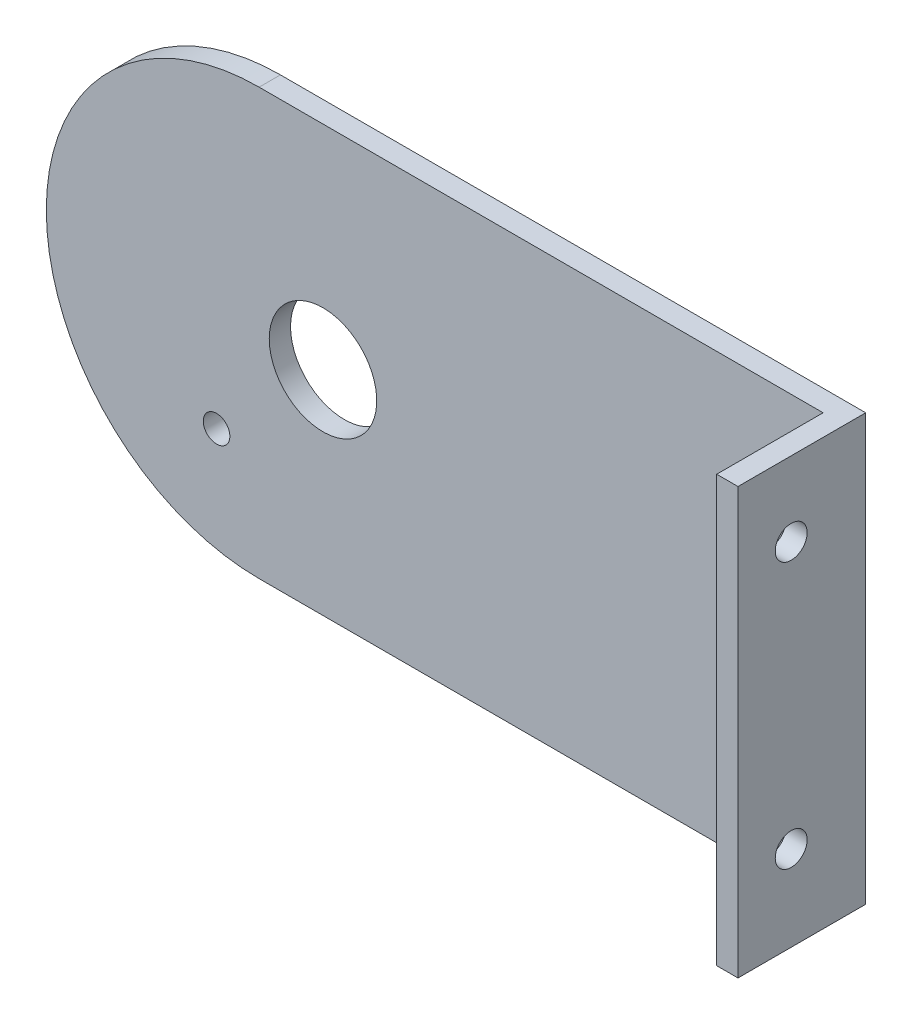
ISO-10303-21;
HEADER;
FILE_DESCRIPTION(('STEP AP214'),'2;1');
FILE_NAME('part.step','',(''),(''),'','','');
FILE_SCHEMA(('AUTOMOTIVE_DESIGN { 1 0 10303 214 1 1 1 1 }'));
ENDSEC;
DATA;
#1=APPLICATION_CONTEXT('core data for automotive mechanical design processes');
#2=APPLICATION_PROTOCOL_DEFINITION('international standard','automotive_design',2000,#1);
#3=PRODUCT_CONTEXT('',#1,'mechanical');
#4=PRODUCT('Part','Part','',(#3));
#5=PRODUCT_RELATED_PRODUCT_CATEGORY('part','',(#4));
#6=PRODUCT_DEFINITION_FORMATION('','',#4);
#7=PRODUCT_DEFINITION_CONTEXT('part definition',#1,'design');
#8=PRODUCT_DEFINITION('design','',#6,#7);
#9=PRODUCT_DEFINITION_SHAPE('','',#8);
#10=(LENGTH_UNIT() NAMED_UNIT(*) SI_UNIT(.MILLI.,.METRE.));
#11=(NAMED_UNIT(*) PLANE_ANGLE_UNIT() SI_UNIT($,.RADIAN.));
#12=(NAMED_UNIT(*) SI_UNIT($,.STERADIAN.) SOLID_ANGLE_UNIT());
#13=UNCERTAINTY_MEASURE_WITH_UNIT(LENGTH_MEASURE(1.E-05),#10,'distance_accuracy_value','');
#14=(GEOMETRIC_REPRESENTATION_CONTEXT(3) GLOBAL_UNCERTAINTY_ASSIGNED_CONTEXT((#13)) GLOBAL_UNIT_ASSIGNED_CONTEXT((#10,
#11,#12)) REPRESENTATION_CONTEXT('',''));
#15=CARTESIAN_POINT('',(0.,0.,0.));
#16=DIRECTION('',(0.,0.,1.));
#17=DIRECTION('',(1.,0.,0.));
#18=AXIS2_PLACEMENT_3D('',#15,#16,#17);
#19=CARTESIAN_POINT('',(75.,0.,2.));
#20=DIRECTION('',(0.,1.,0.));
#21=DIRECTION('',(-1.,0.,0.));
#22=AXIS2_PLACEMENT_3D('',#19,#20,#21);
#23=PLANE('',#22);
#24=DIRECTION('',(1.,0.,0.));
#25=VECTOR('',#24,1.);
#26=CARTESIAN_POINT('',(75.,0.,0.));
#27=LINE('',#26,#25);
#28=CARTESIAN_POINT('',(20.,0.,0.));
#29=VERTEX_POINT('',#28);
#30=CARTESIAN_POINT('',(75.,0.,0.));
#31=VERTEX_POINT('',#30);
#32=EDGE_CURVE('E107',#29,#31,#27,.T.);
#33=ORIENTED_EDGE('',*,*,#32,.T.);
#34=DIRECTION('',(0.,0.,-1.));
#35=VECTOR('',#34,1.);
#36=CARTESIAN_POINT('',(75.,0.,2.));
#37=LINE('',#36,#35);
#38=CARTESIAN_POINT('',(75.,0.,12.));
#39=VERTEX_POINT('',#38);
#40=EDGE_CURVE('E101',#39,#31,#37,.T.);
#41=ORIENTED_EDGE('',*,*,#40,.F.);
#42=DIRECTION('',(-1.,0.,0.));
#43=VECTOR('',#42,1.);
#44=CARTESIAN_POINT('',(75.,0.,12.));
#45=LINE('',#44,#43);
#46=CARTESIAN_POINT('',(73.,0.,12.));
#47=VERTEX_POINT('',#46);
#48=EDGE_CURVE('E104',#39,#47,#45,.T.);
#49=ORIENTED_EDGE('',*,*,#48,.T.);
#50=DIRECTION('',(0.,0.,-1.));
#51=VECTOR('',#50,1.);
#52=CARTESIAN_POINT('',(73.,0.,12.));
#53=LINE('',#52,#51);
#54=CARTESIAN_POINT('',(73.,0.,2.));
#55=VERTEX_POINT('',#54);
#56=EDGE_CURVE('E136',#47,#55,#53,.T.);
#57=ORIENTED_EDGE('',*,*,#56,.T.);
#58=DIRECTION('',(1.,0.,0.));
#59=VECTOR('',#58,1.);
#60=CARTESIAN_POINT('',(75.,0.,2.));
#61=LINE('',#60,#59);
#62=CARTESIAN_POINT('',(20.,0.,2.));
#63=VERTEX_POINT('',#62);
#64=EDGE_CURVE('E64',#63,#55,#61,.T.);
#65=ORIENTED_EDGE('',*,*,#64,.F.);
#66=DIRECTION('',(0.,0.,-1.));
#67=VECTOR('',#66,1.);
#68=CARTESIAN_POINT('',(20.,0.,2.));
#69=LINE('',#68,#67);
#70=EDGE_CURVE('E111',#63,#29,#69,.T.);
#71=ORIENTED_EDGE('',*,*,#70,.T.);
#72=EDGE_LOOP('',(#33,#41,#49,#57,#65,#71));
#73=FACE_BOUND('',#72,.T.);
#74=ADVANCED_FACE('F43',(#73),#23,.F.);
#75=CARTESIAN_POINT('',(75.,40.,2.));
#76=DIRECTION('',(-1.,0.,0.));
#77=DIRECTION('',(0.,0.,1.));
#78=AXIS2_PLACEMENT_3D('',#75,#76,#77);
#79=PLANE('',#78);
#80=CARTESIAN_POINT('',(75.,33.,7.));
#81=DIRECTION('',(-1.,0.,0.));
#82=DIRECTION('',(0.,0.,1.));
#83=AXIS2_PLACEMENT_3D('',#80,#81,#82);
#84=CIRCLE('',#83,1.5);
#85=CARTESIAN_POINT('',(75.,33.,8.5));
#86=VERTEX_POINT('',#85);
#87=EDGE_CURVE('E126',#86,#86,#84,.T.);
#88=ORIENTED_EDGE('',*,*,#87,.T.);
#89=EDGE_LOOP('',(#88));
#90=FACE_BOUND('',#89,.T.);
#91=CARTESIAN_POINT('',(75.,8.,7.));
#92=DIRECTION('',(-1.,0.,0.));
#93=DIRECTION('',(0.,0.,1.));
#94=AXIS2_PLACEMENT_3D('',#91,#92,#93);
#95=CIRCLE('',#94,1.5);
#96=CARTESIAN_POINT('',(75.,8.,8.5));
#97=VERTEX_POINT('',#96);
#98=EDGE_CURVE('E129',#97,#97,#95,.T.);
#99=ORIENTED_EDGE('',*,*,#98,.T.);
#100=EDGE_LOOP('',(#99));
#101=FACE_BOUND('',#100,.T.);
#102=DIRECTION('',(0.,1.,0.));
#103=VECTOR('',#102,1.);
#104=CARTESIAN_POINT('',(75.,40.,0.));
#105=LINE('',#104,#103);
#106=CARTESIAN_POINT('',(75.,40.,0.));
#107=VERTEX_POINT('',#106);
#108=EDGE_CURVE('E159',#31,#107,#105,.T.);
#109=ORIENTED_EDGE('',*,*,#108,.T.);
#110=DIRECTION('',(0.,0.,-1.));
#111=VECTOR('',#110,1.);
#112=CARTESIAN_POINT('',(75.,40.,2.));
#113=LINE('',#112,#111);
#114=CARTESIAN_POINT('',(75.,40.,12.));
#115=VERTEX_POINT('',#114);
#116=EDGE_CURVE('E112',#115,#107,#113,.T.);
#117=ORIENTED_EDGE('',*,*,#116,.F.);
#118=DIRECTION('',(0.,-1.,0.));
#119=VECTOR('',#118,1.);
#120=CARTESIAN_POINT('',(75.,0.,12.));
#121=LINE('',#120,#119);
#122=EDGE_CURVE('E119',#115,#39,#121,.T.);
#123=ORIENTED_EDGE('',*,*,#122,.T.);
#124=ORIENTED_EDGE('',*,*,#40,.T.);
#125=EDGE_LOOP('',(#109,#117,#123,#124));
#126=FACE_BOUND('',#125,.T.);
#127=ADVANCED_FACE('F124',(#90,#101,#126),#79,.F.);
#128=CARTESIAN_POINT('',(0.,40.,2.));
#129=DIRECTION('',(0.,-1.,0.));
#130=DIRECTION('',(0.,0.,-1.));
#131=AXIS2_PLACEMENT_3D('',#128,#129,#130);
#132=PLANE('',#131);
#133=DIRECTION('',(-1.,0.,0.));
#134=VECTOR('',#133,1.);
#135=CARTESIAN_POINT('',(0.,40.,2.));
#136=LINE('',#135,#134);
#137=CARTESIAN_POINT('',(73.,40.,2.));
#138=VERTEX_POINT('',#137);
#139=CARTESIAN_POINT('',(20.,40.,2.));
#140=VERTEX_POINT('',#139);
#141=EDGE_CURVE('E155',#138,#140,#136,.T.);
#142=ORIENTED_EDGE('',*,*,#141,.F.);
#143=DIRECTION('',(0.,0.,-1.));
#144=VECTOR('',#143,1.);
#145=CARTESIAN_POINT('',(73.,40.,12.));
#146=LINE('',#145,#144);
#147=CARTESIAN_POINT('',(73.,40.,12.));
#148=VERTEX_POINT('',#147);
#149=EDGE_CURVE('E137',#148,#138,#146,.T.);
#150=ORIENTED_EDGE('',*,*,#149,.F.);
#151=DIRECTION('',(1.,0.,0.));
#152=VECTOR('',#151,1.);
#153=CARTESIAN_POINT('',(75.,40.,12.));
#154=LINE('',#153,#152);
#155=EDGE_CURVE('E134',#148,#115,#154,.T.);
#156=ORIENTED_EDGE('',*,*,#155,.T.);
#157=ORIENTED_EDGE('',*,*,#116,.T.);
#158=DIRECTION('',(-1.,0.,0.));
#159=VECTOR('',#158,1.);
#160=CARTESIAN_POINT('',(0.,40.,0.));
#161=LINE('',#160,#159);
#162=CARTESIAN_POINT('',(20.,40.,0.));
#163=VERTEX_POINT('',#162);
#164=EDGE_CURVE('E156',#107,#163,#161,.T.);
#165=ORIENTED_EDGE('',*,*,#164,.T.);
#166=DIRECTION('',(0.,0.,-1.));
#167=VECTOR('',#166,1.);
#168=CARTESIAN_POINT('',(20.,40.,2.));
#169=LINE('',#168,#167);
#170=EDGE_CURVE('E11',#163,#140,#169,.F.);
#171=ORIENTED_EDGE('',*,*,#170,.T.);
#172=EDGE_LOOP('',(#142,#150,#156,#157,#165,#171));
#173=FACE_BOUND('',#172,.T.);
#174=ADVANCED_FACE('F187',(#173),#132,.F.);
#175=CARTESIAN_POINT('',(0.,0.,2.));
#176=DIRECTION('',(0.,0.,-1.));
#177=DIRECTION('',(-1.,0.,0.));
#178=AXIS2_PLACEMENT_3D('',#175,#176,#177);
#179=PLANE('',#178);
#180=CARTESIAN_POINT('',(26.,20.,2.));
#181=DIRECTION('',(0.,0.,-1.));
#182=DIRECTION('',(-1.,0.,0.));
#183=AXIS2_PLACEMENT_3D('',#180,#181,#182);
#184=CIRCLE('',#183,5.05000000000008);
#185=CARTESIAN_POINT('',(20.9499999999999,20.,2.));
#186=VERTEX_POINT('',#185);
#187=EDGE_CURVE('E142',#186,#186,#184,.T.);
#188=ORIENTED_EDGE('',*,*,#187,.T.);
#189=EDGE_LOOP('',(#188));
#190=FACE_BOUND('',#189,.T.);
#191=CARTESIAN_POINT('',(16.,10.2020410288673,2.));
#192=DIRECTION('',(0.,0.,-1.));
#193=DIRECTION('',(-1.,0.,0.));
#194=AXIS2_PLACEMENT_3D('',#191,#192,#193);
#195=CIRCLE('',#194,1.25000000000004);
#196=CARTESIAN_POINT('',(14.75,10.2020410288673,2.));
#197=VERTEX_POINT('',#196);
#198=EDGE_CURVE('E151',#197,#197,#195,.T.);
#199=ORIENTED_EDGE('',*,*,#198,.T.);
#200=EDGE_LOOP('',(#199));
#201=FACE_BOUND('',#200,.T.);
#202=ORIENTED_EDGE('',*,*,#64,.T.);
#203=DIRECTION('',(0.,1.,0.));
#204=VECTOR('',#203,1.);
#205=CARTESIAN_POINT('',(73.,0.,2.));
#206=LINE('',#205,#204);
#207=EDGE_CURVE('E59',#55,#138,#206,.T.);
#208=ORIENTED_EDGE('',*,*,#207,.T.);
#209=ORIENTED_EDGE('',*,*,#141,.T.);
#210=CARTESIAN_POINT('',(20.,20.,2.));
#211=DIRECTION('',(0.,0.,-1.));
#212=DIRECTION('',(-1.,0.,0.));
#213=AXIS2_PLACEMENT_3D('',#210,#211,#212);
#214=CIRCLE('',#213,20.);
#215=CARTESIAN_POINT('',(0.,20.,2.));
#216=VERTEX_POINT('',#215);
#217=EDGE_CURVE('E169',#140,#216,#214,.F.);
#218=ORIENTED_EDGE('',*,*,#217,.T.);
#219=CARTESIAN_POINT('',(20.,20.,2.));
#220=DIRECTION('',(0.,0.,-1.));
#221=DIRECTION('',(-1.,0.,0.));
#222=AXIS2_PLACEMENT_3D('',#219,#220,#221);
#223=CIRCLE('',#222,20.);
#224=EDGE_CURVE('E52',#216,#63,#223,.F.);
#225=ORIENTED_EDGE('',*,*,#224,.T.);
#226=EDGE_LOOP('',(#202,#208,#209,#218,#225));
#227=FACE_BOUND('',#226,.T.);
#228=ADVANCED_FACE('F172',(#190,#201,#227),#179,.F.);
#229=CARTESIAN_POINT('',(0.,0.,0.));
#230=DIRECTION('',(0.,0.,-1.));
#231=DIRECTION('',(-1.,0.,0.));
#232=AXIS2_PLACEMENT_3D('',#229,#230,#231);
#233=PLANE('',#232);
#234=CARTESIAN_POINT('',(20.,20.,0.));
#235=DIRECTION('',(0.,0.,-1.));
#236=DIRECTION('',(-1.,0.,0.));
#237=AXIS2_PLACEMENT_3D('',#234,#235,#236);
#238=CIRCLE('',#237,20.);
#239=CARTESIAN_POINT('',(0.,20.,0.));
#240=VERTEX_POINT('',#239);
#241=EDGE_CURVE('E164',#240,#163,#238,.T.);
#242=ORIENTED_EDGE('',*,*,#241,.T.);
#243=ORIENTED_EDGE('',*,*,#164,.F.);
#244=ORIENTED_EDGE('',*,*,#108,.F.);
#245=ORIENTED_EDGE('',*,*,#32,.F.);
#246=CARTESIAN_POINT('',(20.,20.,0.));
#247=DIRECTION('',(0.,0.,-1.));
#248=DIRECTION('',(-1.,0.,0.));
#249=AXIS2_PLACEMENT_3D('',#246,#247,#248);
#250=CIRCLE('',#249,20.);
#251=EDGE_CURVE('E167',#29,#240,#250,.T.);
#252=ORIENTED_EDGE('',*,*,#251,.T.);
#253=EDGE_LOOP('',(#242,#243,#244,#245,#252));
#254=FACE_BOUND('',#253,.T.);
#255=CARTESIAN_POINT('',(26.,20.,0.));
#256=DIRECTION('',(0.,0.,-1.));
#257=DIRECTION('',(-1.,0.,0.));
#258=AXIS2_PLACEMENT_3D('',#255,#256,#257);
#259=CIRCLE('',#258,5.05000000000008);
#260=CARTESIAN_POINT('',(20.9499999999999,20.,0.));
#261=VERTEX_POINT('',#260);
#262=EDGE_CURVE('E145',#261,#261,#259,.T.);
#263=ORIENTED_EDGE('',*,*,#262,.F.);
#264=EDGE_LOOP('',(#263));
#265=FACE_BOUND('',#264,.T.);
#266=CARTESIAN_POINT('',(16.,10.2020410288673,0.));
#267=DIRECTION('',(0.,0.,-1.));
#268=DIRECTION('',(-1.,0.,0.));
#269=AXIS2_PLACEMENT_3D('',#266,#267,#268);
#270=CIRCLE('',#269,1.25000000000004);
#271=CARTESIAN_POINT('',(14.75,10.2020410288673,0.));
#272=VERTEX_POINT('',#271);
#273=EDGE_CURVE('E148',#272,#272,#270,.T.);
#274=ORIENTED_EDGE('',*,*,#273,.F.);
#275=EDGE_LOOP('',(#274));
#276=FACE_BOUND('',#275,.T.);
#277=ADVANCED_FACE('F181',(#254,#265,#276),#233,.T.);
#278=CARTESIAN_POINT('',(16.,10.2020410288673,2.));
#279=DIRECTION('',(0.,0.,-1.));
#280=DIRECTION('',(-1.,0.,0.));
#281=AXIS2_PLACEMENT_3D('',#278,#279,#280);
#282=CYLINDRICAL_SURFACE('',#281,1.25000000000004);
#283=ORIENTED_EDGE('',*,*,#198,.F.);
#284=EDGE_LOOP('',(#283));
#285=FACE_BOUND('',#284,.T.);
#286=ORIENTED_EDGE('',*,*,#273,.T.);
#287=EDGE_LOOP('',(#286));
#288=FACE_BOUND('',#287,.T.);
#289=ADVANCED_FACE('F215',(#285,#288),#282,.F.);
#290=CARTESIAN_POINT('',(26.,20.,2.));
#291=DIRECTION('',(0.,0.,-1.));
#292=DIRECTION('',(-1.,0.,0.));
#293=AXIS2_PLACEMENT_3D('',#290,#291,#292);
#294=CYLINDRICAL_SURFACE('',#293,5.05000000000008);
#295=ORIENTED_EDGE('',*,*,#187,.F.);
#296=EDGE_LOOP('',(#295));
#297=FACE_BOUND('',#296,.T.);
#298=ORIENTED_EDGE('',*,*,#262,.T.);
#299=EDGE_LOOP('',(#298));
#300=FACE_BOUND('',#299,.T.);
#301=ADVANCED_FACE('F220',(#297,#300),#294,.F.);
#302=CARTESIAN_POINT('',(20.,20.,2.));
#303=DIRECTION('',(0.,0.,-1.));
#304=DIRECTION('',(-1.,0.,0.));
#305=AXIS2_PLACEMENT_3D('',#302,#303,#304);
#306=CYLINDRICAL_SURFACE('',#305,20.);
#307=DIRECTION('',(0.,0.,-1.));
#308=VECTOR('',#307,1.);
#309=CARTESIAN_POINT('',(0.,20.,2.));
#310=LINE('',#309,#308);
#311=EDGE_CURVE('E47',#216,#240,#310,.T.);
#312=ORIENTED_EDGE('',*,*,#311,.F.);
#313=ORIENTED_EDGE('',*,*,#217,.F.);
#314=ORIENTED_EDGE('',*,*,#170,.F.);
#315=ORIENTED_EDGE('',*,*,#241,.F.);
#316=EDGE_LOOP('',(#312,#313,#314,#315));
#317=FACE_BOUND('',#316,.T.);
#318=ADVANCED_FACE('F45',(#317),#306,.T.);
#319=CARTESIAN_POINT('',(20.,20.,2.));
#320=DIRECTION('',(0.,0.,-1.));
#321=DIRECTION('',(-1.,0.,0.));
#322=AXIS2_PLACEMENT_3D('',#319,#320,#321);
#323=CYLINDRICAL_SURFACE('',#322,20.);
#324=ORIENTED_EDGE('',*,*,#224,.F.);
#325=ORIENTED_EDGE('',*,*,#311,.T.);
#326=ORIENTED_EDGE('',*,*,#251,.F.);
#327=ORIENTED_EDGE('',*,*,#70,.F.);
#328=EDGE_LOOP('',(#324,#325,#326,#327));
#329=FACE_BOUND('',#328,.T.);
#330=ADVANCED_FACE('F178',(#329),#323,.T.);
#331=CARTESIAN_POINT('',(73.,0.,12.));
#332=DIRECTION('',(-1.,0.,0.));
#333=DIRECTION('',(0.,0.,1.));
#334=AXIS2_PLACEMENT_3D('',#331,#332,#333);
#335=PLANE('',#334);
#336=CARTESIAN_POINT('',(73.,33.,7.));
#337=DIRECTION('',(-1.,0.,0.));
#338=DIRECTION('',(0.,0.,1.));
#339=AXIS2_PLACEMENT_3D('',#336,#337,#338);
#340=CIRCLE('',#339,1.5);
#341=CARTESIAN_POINT('',(73.,33.,8.5));
#342=VERTEX_POINT('',#341);
#343=EDGE_CURVE('E299',#342,#342,#340,.T.);
#344=ORIENTED_EDGE('',*,*,#343,.F.);
#345=EDGE_LOOP('',(#344));
#346=FACE_BOUND('',#345,.T.);
#347=CARTESIAN_POINT('',(73.,8.,7.));
#348=DIRECTION('',(-1.,0.,0.));
#349=DIRECTION('',(0.,0.,1.));
#350=AXIS2_PLACEMENT_3D('',#347,#348,#349);
#351=CIRCLE('',#350,1.5);
#352=CARTESIAN_POINT('',(73.,8.,8.5));
#353=VERTEX_POINT('',#352);
#354=EDGE_CURVE('E305',#353,#353,#351,.T.);
#355=ORIENTED_EDGE('',*,*,#354,.F.);
#356=EDGE_LOOP('',(#355));
#357=FACE_BOUND('',#356,.T.);
#358=ORIENTED_EDGE('',*,*,#207,.F.);
#359=ORIENTED_EDGE('',*,*,#56,.F.);
#360=DIRECTION('',(0.,1.,0.));
#361=VECTOR('',#360,1.);
#362=CARTESIAN_POINT('',(73.,0.,12.));
#363=LINE('',#362,#361);
#364=EDGE_CURVE('E122',#47,#148,#363,.T.);
#365=ORIENTED_EDGE('',*,*,#364,.T.);
#366=ORIENTED_EDGE('',*,*,#149,.T.);
#367=EDGE_LOOP('',(#358,#359,#365,#366));
#368=FACE_BOUND('',#367,.T.);
#369=ADVANCED_FACE('F189',(#346,#357,#368),#335,.T.);
#370=CARTESIAN_POINT('',(0.,0.,12.));
#371=DIRECTION('',(0.,0.,1.));
#372=DIRECTION('',(1.,0.,0.));
#373=AXIS2_PLACEMENT_3D('',#370,#371,#372);
#374=PLANE('',#373);
#375=ORIENTED_EDGE('',*,*,#122,.F.);
#376=ORIENTED_EDGE('',*,*,#155,.F.);
#377=ORIENTED_EDGE('',*,*,#364,.F.);
#378=ORIENTED_EDGE('',*,*,#48,.F.);
#379=EDGE_LOOP('',(#375,#376,#377,#378));
#380=FACE_BOUND('',#379,.T.);
#381=ADVANCED_FACE('F117',(#380),#374,.T.);
#382=CARTESIAN_POINT('',(83.,8.,7.));
#383=DIRECTION('',(-1.,0.,0.));
#384=DIRECTION('',(0.,0.,1.));
#385=AXIS2_PLACEMENT_3D('',#382,#383,#384);
#386=CYLINDRICAL_SURFACE('',#385,1.5);
#387=ORIENTED_EDGE('',*,*,#354,.T.);
#388=EDGE_LOOP('',(#387));
#389=FACE_BOUND('',#388,.T.);
#390=ORIENTED_EDGE('',*,*,#98,.F.);
#391=EDGE_LOOP('',(#390));
#392=FACE_BOUND('',#391,.T.);
#393=ADVANCED_FACE('F198',(#389,#392),#386,.F.);
#394=CARTESIAN_POINT('',(83.,33.,7.));
#395=DIRECTION('',(-1.,0.,0.));
#396=DIRECTION('',(0.,0.,1.));
#397=AXIS2_PLACEMENT_3D('',#394,#395,#396);
#398=CYLINDRICAL_SURFACE('',#397,1.5);
#399=ORIENTED_EDGE('',*,*,#343,.T.);
#400=EDGE_LOOP('',(#399));
#401=FACE_BOUND('',#400,.T.);
#402=ORIENTED_EDGE('',*,*,#87,.F.);
#403=EDGE_LOOP('',(#402));
#404=FACE_BOUND('',#403,.T.);
#405=ADVANCED_FACE('F284',(#401,#404),#398,.F.);
#406=CLOSED_SHELL('',(#74,#127,#174,#228,#277,#289,#301,#318,#330,#369,#381,#393,#405));
#407=MANIFOLD_SOLID_BREP('B2',#406);
#408=ADVANCED_BREP_SHAPE_REPRESENTATION('',(#18,#407),#14);
#409=SHAPE_DEFINITION_REPRESENTATION(#9,#408);
ENDSEC;
END-ISO-10303-21;
